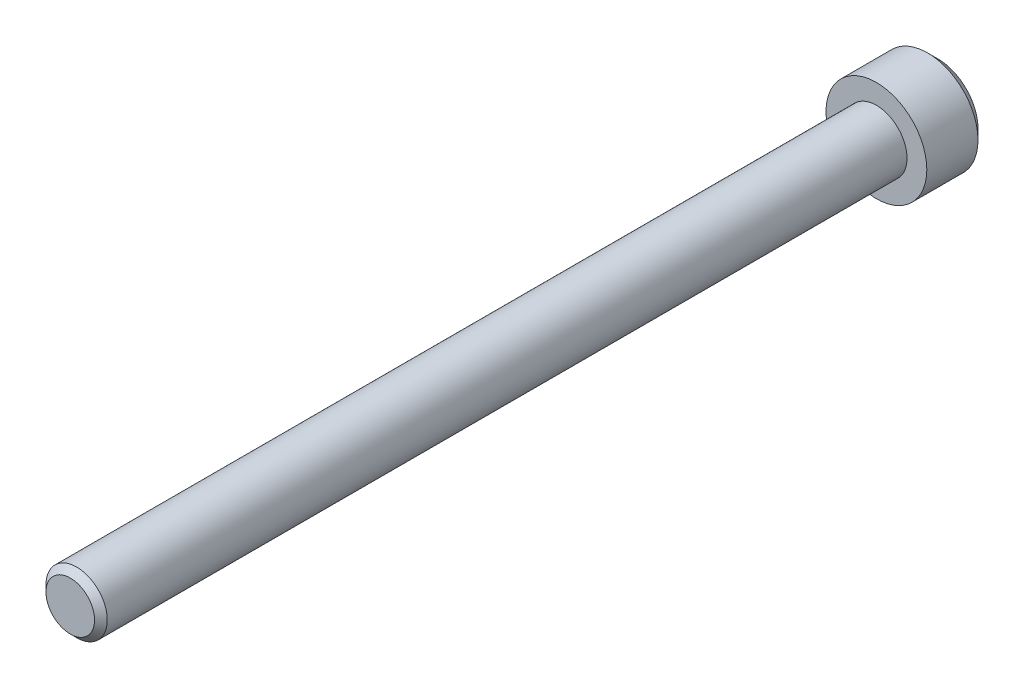
ISO-10303-21;
HEADER;
FILE_DESCRIPTION(('STEP AP214'),'2;1');
FILE_NAME('part.step','',(''),(''),'','','');
FILE_SCHEMA(('AUTOMOTIVE_DESIGN { 1 0 10303 214 1 1 1 1 }'));
ENDSEC;
DATA;
#1=APPLICATION_CONTEXT('core data for automotive mechanical design processes');
#2=APPLICATION_PROTOCOL_DEFINITION('international standard','automotive_design',2000,#1);
#3=PRODUCT_CONTEXT('',#1,'mechanical');
#4=PRODUCT('Part','Part','',(#3));
#5=PRODUCT_RELATED_PRODUCT_CATEGORY('part','',(#4));
#6=PRODUCT_DEFINITION_FORMATION('','',#4);
#7=PRODUCT_DEFINITION_CONTEXT('part definition',#1,'design');
#8=PRODUCT_DEFINITION('design','',#6,#7);
#9=PRODUCT_DEFINITION_SHAPE('','',#8);
#10=(LENGTH_UNIT() NAMED_UNIT(*) SI_UNIT(.MILLI.,.METRE.));
#11=(NAMED_UNIT(*) PLANE_ANGLE_UNIT() SI_UNIT($,.RADIAN.));
#12=(NAMED_UNIT(*) SI_UNIT($,.STERADIAN.) SOLID_ANGLE_UNIT());
#13=UNCERTAINTY_MEASURE_WITH_UNIT(LENGTH_MEASURE(1.E-05),#10,'distance_accuracy_value','');
#14=(GEOMETRIC_REPRESENTATION_CONTEXT(3) GLOBAL_UNCERTAINTY_ASSIGNED_CONTEXT((#13)) GLOBAL_UNIT_ASSIGNED_CONTEXT((#10,
#11,#12)) REPRESENTATION_CONTEXT('',''));
#15=CARTESIAN_POINT('',(0.,0.,0.));
#16=DIRECTION('',(0.,0.,1.));
#17=DIRECTION('',(1.,0.,0.));
#18=AXIS2_PLACEMENT_3D('',#15,#16,#17);
#19=CARTESIAN_POINT('',(75.6412,46.355,-54.2417));
#20=DIRECTION('',(0.,0.,1.));
#21=DIRECTION('',(1.,0.,0.));
#22=AXIS2_PLACEMENT_3D('',#19,#20,#21);
#23=PLANE('',#22);
#24=DIRECTION('',(0.608447428642477,0.793594182550728,0.));
#25=VECTOR('',#24,1.);
#26=CARTESIAN_POINT('',(77.2159884559992,45.1476121337877,-54.2417));
#27=LINE('',#26,#25);
#28=CARTESIAN_POINT('',(77.9130741655732,46.0568166727753,-54.2417));
#29=VERTEX_POINT('',#28);
#30=CARTESIAN_POINT('',(76.5189027464251,44.2384075947999,-54.2417));
#31=VERTEX_POINT('',#30);
#32=EDGE_CURVE('E131',#29,#31,#27,.F.);
#33=ORIENTED_EDGE('',*,*,#32,.T.);
#34=DIRECTION('',(0.991496436705714,-0.13013383879634,0.));
#35=VECTOR('',#34,1.);
#36=CARTESIAN_POINT('',(75.3829656636386,44.3874992584122,-54.2417));
#37=LINE('',#36,#35);
#38=CARTESIAN_POINT('',(74.2470285808521,44.5365909220243,-54.2417));
#39=VERTEX_POINT('',#38);
#40=EDGE_CURVE('E135',#31,#39,#37,.F.);
#41=ORIENTED_EDGE('',*,*,#40,.T.);
#42=DIRECTION('',(0.383049008063238,-0.923728021347068,0.));
#43=VECTOR('',#42,1.);
#44=CARTESIAN_POINT('',(73.8081772076394,45.5948871246245,-54.2417));
#45=LINE('',#44,#43);
#46=CARTESIAN_POINT('',(73.369325834427,46.6531833272247,-54.2417));
#47=VERTEX_POINT('',#46);
#48=EDGE_CURVE('E83',#39,#47,#45,.F.);
#49=ORIENTED_EDGE('',*,*,#48,.T.);
#50=DIRECTION('',(-0.608447428642477,-0.793594182550728,0.));
#51=VECTOR('',#50,1.);
#52=CARTESIAN_POINT('',(74.066411544001,47.5623878662123,-54.2417));
#53=LINE('',#52,#51);
#54=CARTESIAN_POINT('',(74.7634972535751,48.4715924052002,-54.2417));
#55=VERTEX_POINT('',#54);
#56=EDGE_CURVE('E66',#47,#55,#53,.F.);
#57=ORIENTED_EDGE('',*,*,#56,.T.);
#58=DIRECTION('',(-0.991496436705714,0.13013383879634,0.));
#59=VECTOR('',#58,1.);
#60=CARTESIAN_POINT('',(75.8994343363616,48.3225007415878,-54.2417));
#61=LINE('',#60,#59);
#62=CARTESIAN_POINT('',(77.0353714191481,48.1734090779756,-54.2417));
#63=VERTEX_POINT('',#62);
#64=EDGE_CURVE('E71',#55,#63,#61,.F.);
#65=ORIENTED_EDGE('',*,*,#64,.T.);
#66=DIRECTION('',(-0.383049008063237,0.923728021347068,0.));
#67=VECTOR('',#66,1.);
#68=CARTESIAN_POINT('',(77.4742227923606,47.1151128753755,-54.2417));
#69=LINE('',#68,#67);
#70=EDGE_CURVE('E127',#63,#29,#69,.F.);
#71=ORIENTED_EDGE('',*,*,#70,.T.);
#72=EDGE_LOOP('',(#33,#41,#49,#57,#65,#71));
#73=FACE_BOUND('',#72,.T.);
#74=ADVANCED_FACE('F16',(#73),#23,.F.);
#75=CARTESIAN_POINT('',(75.8994343363616,48.3225007415878,-55.3847));
#76=DIRECTION('',(0.13013383879634,0.991496436705714,0.));
#77=DIRECTION('',(-0.991496436705714,0.13013383879634,0.));
#78=AXIS2_PLACEMENT_3D('',#75,#76,#77);
#79=PLANE('',#78);
#80=DIRECTION('',(0.,0.,1.));
#81=VECTOR('',#80,1.);
#82=CARTESIAN_POINT('',(74.7634972535751,48.4715924052002,-55.3847));
#83=LINE('',#82,#81);
#84=CARTESIAN_POINT('',(74.7634972535751,48.4715924052002,-56.5277));
#85=VERTEX_POINT('',#84);
#86=EDGE_CURVE('E73',#55,#85,#83,.F.);
#87=ORIENTED_EDGE('',*,*,#86,.T.);
#88=DIRECTION('',(-0.991496436705721,0.13013383879629,0.));
#89=VECTOR('',#88,1.);
#90=CARTESIAN_POINT('',(77.0353714191482,48.1734090779757,-56.5277));
#91=LINE('',#90,#89);
#92=CARTESIAN_POINT('',(77.0353714191481,48.1734090779756,-56.5277));
#93=VERTEX_POINT('',#92);
#94=EDGE_CURVE('E125',#93,#85,#91,.T.);
#95=ORIENTED_EDGE('',*,*,#94,.F.);
#96=DIRECTION('',(0.,0.,1.));
#97=VECTOR('',#96,1.);
#98=CARTESIAN_POINT('',(77.035371419148,48.1734090779756,-55.3847));
#99=LINE('',#98,#97);
#100=EDGE_CURVE('E76',#93,#63,#99,.T.);
#101=ORIENTED_EDGE('',*,*,#100,.T.);
#102=ORIENTED_EDGE('',*,*,#64,.F.);
#103=EDGE_LOOP('',(#87,#95,#101,#102));
#104=FACE_BOUND('',#103,.T.);
#105=ADVANCED_FACE('F72',(#104),#79,.F.);
#106=CARTESIAN_POINT('',(74.066411544001,47.5623878662123,-55.3847));
#107=DIRECTION('',(-0.793594182550728,0.608447428642477,0.));
#108=DIRECTION('',(-0.608447428642477,-0.793594182550728,0.));
#109=AXIS2_PLACEMENT_3D('',#106,#107,#108);
#110=PLANE('',#109);
#111=DIRECTION('',(0.,0.,1.));
#112=VECTOR('',#111,1.);
#113=CARTESIAN_POINT('',(73.3693258344268,46.6531833272246,-55.3847));
#114=LINE('',#113,#112);
#115=CARTESIAN_POINT('',(73.369325834427,46.6531833272247,-56.5277));
#116=VERTEX_POINT('',#115);
#117=EDGE_CURVE('E85',#47,#116,#114,.F.);
#118=ORIENTED_EDGE('',*,*,#117,.T.);
#119=DIRECTION('',(-0.608447428642512,-0.793594182550701,0.));
#120=VECTOR('',#119,1.);
#121=CARTESIAN_POINT('',(74.7634972535751,48.4715924052002,-56.5277));
#122=LINE('',#121,#120);
#123=EDGE_CURVE('E89',#85,#116,#122,.T.);
#124=ORIENTED_EDGE('',*,*,#123,.F.);
#125=ORIENTED_EDGE('',*,*,#86,.F.);
#126=ORIENTED_EDGE('',*,*,#56,.F.);
#127=EDGE_LOOP('',(#118,#124,#125,#126));
#128=FACE_BOUND('',#127,.T.);
#129=ADVANCED_FACE('F87',(#128),#110,.F.);
#130=CARTESIAN_POINT('',(73.8081772076394,45.5948871246245,-55.3847));
#131=DIRECTION('',(-0.923728021347068,-0.383049008063238,0.));
#132=DIRECTION('',(0.383049008063238,-0.923728021347068,0.));
#133=AXIS2_PLACEMENT_3D('',#130,#131,#132);
#134=PLANE('',#133);
#135=DIRECTION('',(0.,0.,1.));
#136=VECTOR('',#135,1.);
#137=CARTESIAN_POINT('',(74.2470285808521,44.5365909220245,-55.3847));
#138=LINE('',#137,#136);
#139=CARTESIAN_POINT('',(74.2470285808521,44.5365909220243,-56.5277));
#140=VERTEX_POINT('',#139);
#141=EDGE_CURVE('E137',#39,#140,#138,.F.);
#142=ORIENTED_EDGE('',*,*,#141,.T.);
#143=DIRECTION('',(0.383049008063221,-0.923728021347075,0.));
#144=VECTOR('',#143,1.);
#145=CARTESIAN_POINT('',(73.369325834427,46.6531833272247,-56.5277));
#146=LINE('',#145,#144);
#147=EDGE_CURVE('E121',#116,#140,#146,.T.);
#148=ORIENTED_EDGE('',*,*,#147,.F.);
#149=ORIENTED_EDGE('',*,*,#117,.F.);
#150=ORIENTED_EDGE('',*,*,#48,.F.);
#151=EDGE_LOOP('',(#142,#148,#149,#150));
#152=FACE_BOUND('',#151,.T.);
#153=ADVANCED_FACE('F141',(#152),#134,.F.);
#154=CARTESIAN_POINT('',(75.3829656636386,44.3874992584122,-55.3847));
#155=DIRECTION('',(-0.13013383879634,-0.991496436705714,0.));
#156=DIRECTION('',(0.991496436705714,-0.13013383879634,0.));
#157=AXIS2_PLACEMENT_3D('',#154,#155,#156);
#158=PLANE('',#157);
#159=DIRECTION('',(0.,0.,1.));
#160=VECTOR('',#159,1.);
#161=CARTESIAN_POINT('',(76.5189027464251,44.2384075947998,-55.3847));
#162=LINE('',#161,#160);
#163=CARTESIAN_POINT('',(76.5189027464251,44.2384075947999,-56.5277));
#164=VERTEX_POINT('',#163);
#165=EDGE_CURVE('E133',#31,#164,#162,.F.);
#166=ORIENTED_EDGE('',*,*,#165,.T.);
#167=DIRECTION('',(0.99149643670572,-0.130133838796296,0.));
#168=VECTOR('',#167,1.);
#169=CARTESIAN_POINT('',(74.2470285808521,44.5365909220243,-56.5277));
#170=LINE('',#169,#168);
#171=EDGE_CURVE('E118',#140,#164,#170,.T.);
#172=ORIENTED_EDGE('',*,*,#171,.F.);
#173=ORIENTED_EDGE('',*,*,#141,.F.);
#174=ORIENTED_EDGE('',*,*,#40,.F.);
#175=EDGE_LOOP('',(#166,#172,#173,#174));
#176=FACE_BOUND('',#175,.T.);
#177=ADVANCED_FACE('F151',(#176),#158,.F.);
#178=CARTESIAN_POINT('',(77.2159884559992,45.1476121337877,-55.3847));
#179=DIRECTION('',(0.793594182550728,-0.608447428642477,0.));
#180=DIRECTION('',(0.608447428642477,0.793594182550728,0.));
#181=AXIS2_PLACEMENT_3D('',#178,#179,#180);
#182=PLANE('',#181);
#183=DIRECTION('',(0.,0.,1.));
#184=VECTOR('',#183,1.);
#185=CARTESIAN_POINT('',(77.9130741655732,46.0568166727753,-55.3847));
#186=LINE('',#185,#184);
#187=CARTESIAN_POINT('',(77.9130741655732,46.0568166727753,-56.5277));
#188=VERTEX_POINT('',#187);
#189=EDGE_CURVE('E34',#29,#188,#186,.F.);
#190=ORIENTED_EDGE('',*,*,#189,.T.);
#191=DIRECTION('',(0.608447428642539,0.79359418255068,0.));
#192=VECTOR('',#191,1.);
#193=CARTESIAN_POINT('',(76.5189027464251,44.2384075947998,-56.5277));
#194=LINE('',#193,#192);
#195=EDGE_CURVE('E115',#164,#188,#194,.T.);
#196=ORIENTED_EDGE('',*,*,#195,.F.);
#197=ORIENTED_EDGE('',*,*,#165,.F.);
#198=ORIENTED_EDGE('',*,*,#32,.F.);
#199=EDGE_LOOP('',(#190,#196,#197,#198));
#200=FACE_BOUND('',#199,.T.);
#201=ADVANCED_FACE('F149',(#200),#182,.F.);
#202=CARTESIAN_POINT('',(77.4742227923606,47.1151128753755,-55.3847));
#203=DIRECTION('',(0.923728021347068,0.383049008063237,0.));
#204=DIRECTION('',(-0.383049008063237,0.923728021347068,0.));
#205=AXIS2_PLACEMENT_3D('',#202,#203,#204);
#206=PLANE('',#205);
#207=ORIENTED_EDGE('',*,*,#100,.F.);
#208=DIRECTION('',(-0.383049008063216,0.923728021347077,0.));
#209=VECTOR('',#208,1.);
#210=CARTESIAN_POINT('',(77.9130741655733,46.0568166727753,-56.5277));
#211=LINE('',#210,#209);
#212=EDGE_CURVE('E106',#188,#93,#211,.T.);
#213=ORIENTED_EDGE('',*,*,#212,.F.);
#214=ORIENTED_EDGE('',*,*,#189,.F.);
#215=ORIENTED_EDGE('',*,*,#70,.F.);
#216=EDGE_LOOP('',(#207,#213,#214,#215));
#217=FACE_BOUND('',#216,.T.);
#218=ADVANCED_FACE('F147',(#217),#206,.F.);
#219=CARTESIAN_POINT('',(75.6412,46.355,-56.5277));
#220=DIRECTION('',(0.,0.,-1.));
#221=DIRECTION('',(-1.,0.,0.));
#222=AXIS2_PLACEMENT_3D('',#219,#220,#221);
#223=PLANE('',#222);
#224=CARTESIAN_POINT('',(75.6412,46.355,-56.5277000007427));
#225=DIRECTION('',(0.,0.,1.));
#226=DIRECTION('',(1.,0.,0.));
#227=AXIS2_PLACEMENT_3D('',#224,#225,#226);
#228=CIRCLE('',#227,3.17500000071682);
#229=CARTESIAN_POINT('',(78.8162000007168,46.355,-56.5277000007427));
#230=VERTEX_POINT('',#229);
#231=EDGE_CURVE('E19',#230,#230,#228,.T.);
#232=ORIENTED_EDGE('',*,*,#231,.F.);
#233=EDGE_LOOP('',(#232));
#234=FACE_BOUND('',#233,.T.);
#235=ORIENTED_EDGE('',*,*,#195,.T.);
#236=ORIENTED_EDGE('',*,*,#212,.T.);
#237=ORIENTED_EDGE('',*,*,#94,.T.);
#238=ORIENTED_EDGE('',*,*,#123,.T.);
#239=ORIENTED_EDGE('',*,*,#147,.T.);
#240=ORIENTED_EDGE('',*,*,#171,.T.);
#241=EDGE_LOOP('',(#235,#236,#237,#238,#239,#240));
#242=FACE_BOUND('',#241,.T.);
#243=ADVANCED_FACE('F145',(#234,#242),#223,.T.);
#244=CARTESIAN_POINT('',(75.6412,46.355,-55.7339500002172));
#245=DIRECTION('',(0.,0.,1.));
#246=DIRECTION('',(1.,0.,0.));
#247=AXIS2_PLACEMENT_3D('',#244,#245,#246);
#248=CONICAL_SURFACE('',#247,3.96874999982188,0.785398162502687);
#249=CARTESIAN_POINT('',(75.6412,46.355,-55.73395));
#250=DIRECTION('',(0.,0.,1.));
#251=DIRECTION('',(1.,0.,0.));
#252=AXIS2_PLACEMENT_3D('',#249,#250,#251);
#253=CIRCLE('',#252,3.96875);
#254=CARTESIAN_POINT('',(79.60995,46.355,-55.73395));
#255=VERTEX_POINT('',#254);
#256=EDGE_CURVE('E98',#255,#255,#253,.T.);
#257=ORIENTED_EDGE('',*,*,#256,.F.);
#258=EDGE_LOOP('',(#257));
#259=FACE_BOUND('',#258,.T.);
#260=ORIENTED_EDGE('',*,*,#231,.T.);
#261=EDGE_LOOP('',(#260));
#262=FACE_BOUND('',#261,.T.);
#263=ADVANCED_FACE('F182',(#259,#262),#248,.T.);
#264=CARTESIAN_POINT('',(130.369226232822,59.055,11.7983));
#265=DIRECTION('',(0.,0.,-1.));
#266=DIRECTION('',(0.,1.,0.));
#267=AXIS2_PLACEMENT_3D('',#264,#265,#266);
#268=PLANE('',#267);
#269=CARTESIAN_POINT('',(75.6412,46.355,11.7983000000095));
#270=DIRECTION('',(0.,0.,-1.));
#271=DIRECTION('',(-1.,0.,0.));
#272=AXIS2_PLACEMENT_3D('',#269,#270,#271);
#273=CIRCLE('',#272,1.91299999999499);
#274=CARTESIAN_POINT('',(73.728200000005,46.355,11.7983000000095));
#275=VERTEX_POINT('',#274);
#276=EDGE_CURVE('E96',#275,#275,#273,.T.);
#277=ORIENTED_EDGE('',*,*,#276,.F.);
#278=EDGE_LOOP('',(#277));
#279=FACE_BOUND('',#278,.T.);
#280=ADVANCED_FACE('F179',(#279),#268,.F.);
#281=CARTESIAN_POINT('',(75.6412,46.355,-51.7017));
#282=DIRECTION('',(0.,0.,1.));
#283=DIRECTION('',(1.,0.,0.));
#284=AXIS2_PLACEMENT_3D('',#281,#282,#283);
#285=CYLINDRICAL_SURFACE('',#284,3.96875);
#286=ORIENTED_EDGE('',*,*,#256,.T.);
#287=EDGE_LOOP('',(#286));
#288=FACE_BOUND('',#287,.T.);
#289=CARTESIAN_POINT('',(75.6412,46.355,-51.7017));
#290=DIRECTION('',(0.,0.,1.));
#291=DIRECTION('',(1.,0.,0.));
#292=AXIS2_PLACEMENT_3D('',#289,#290,#291);
#293=CIRCLE('',#292,3.96875);
#294=CARTESIAN_POINT('',(79.60995,46.355,-51.7017));
#295=VERTEX_POINT('',#294);
#296=EDGE_CURVE('E94',#295,#295,#293,.T.);
#297=ORIENTED_EDGE('',*,*,#296,.F.);
#298=EDGE_LOOP('',(#297));
#299=FACE_BOUND('',#298,.T.);
#300=ADVANCED_FACE('F176',(#288,#299),#285,.T.);
#301=CARTESIAN_POINT('',(75.6412,46.355,11.2983000000213));
#302=DIRECTION('',(0.,0.,-1.));
#303=DIRECTION('',(-1.,0.,0.));
#304=AXIS2_PLACEMENT_3D('',#301,#302,#303);
#305=CONICAL_SURFACE('',#304,2.41299999998316,0.785398163397448);
#306=ORIENTED_EDGE('',*,*,#276,.T.);
#307=EDGE_LOOP('',(#306));
#308=FACE_BOUND('',#307,.T.);
#309=CARTESIAN_POINT('',(75.6412,46.355,11.2983));
#310=DIRECTION('',(0.,0.,-1.));
#311=DIRECTION('',(-1.,0.,0.));
#312=AXIS2_PLACEMENT_3D('',#309,#310,#311);
#313=CIRCLE('',#312,2.413);
#314=CARTESIAN_POINT('',(73.2282,46.355,11.2983));
#315=VERTEX_POINT('',#314);
#316=EDGE_CURVE('E25',#315,#315,#313,.T.);
#317=ORIENTED_EDGE('',*,*,#316,.F.);
#318=EDGE_LOOP('',(#317));
#319=FACE_BOUND('',#318,.T.);
#320=ADVANCED_FACE('F169',(#308,#319),#305,.T.);
#321=CARTESIAN_POINT('',(75.6412,46.355,-51.7017));
#322=DIRECTION('',(0.,0.,1.));
#323=DIRECTION('',(1.,0.,0.));
#324=AXIS2_PLACEMENT_3D('',#321,#322,#323);
#325=PLANE('',#324);
#326=CARTESIAN_POINT('',(75.6412,46.355,-51.7017));
#327=DIRECTION('',(0.,0.,-1.));
#328=DIRECTION('',(-1.,0.,0.));
#329=AXIS2_PLACEMENT_3D('',#326,#327,#328);
#330=CIRCLE('',#329,2.413);
#331=CARTESIAN_POINT('',(73.2282,46.355,-51.7017));
#332=VERTEX_POINT('',#331);
#333=EDGE_CURVE('E11',#332,#332,#330,.F.);
#334=ORIENTED_EDGE('',*,*,#333,.F.);
#335=EDGE_LOOP('',(#334));
#336=FACE_BOUND('',#335,.T.);
#337=ORIENTED_EDGE('',*,*,#296,.T.);
#338=EDGE_LOOP('',(#337));
#339=FACE_BOUND('',#338,.T.);
#340=ADVANCED_FACE('F163',(#336,#339),#325,.T.);
#341=CARTESIAN_POINT('',(75.6412,46.355,-51.7017));
#342=DIRECTION('',(0.,0.,-1.));
#343=DIRECTION('',(-1.,0.,0.));
#344=AXIS2_PLACEMENT_3D('',#341,#342,#343);
#345=CYLINDRICAL_SURFACE('',#344,2.413);
#346=ORIENTED_EDGE('',*,*,#333,.T.);
#347=EDGE_LOOP('',(#346));
#348=FACE_BOUND('',#347,.T.);
#349=ORIENTED_EDGE('',*,*,#316,.T.);
#350=EDGE_LOOP('',(#349));
#351=FACE_BOUND('',#350,.T.);
#352=ADVANCED_FACE('F161',(#348,#351),#345,.T.);
#353=CLOSED_SHELL('',(#74,#105,#129,#153,#177,#201,#218,#243,#263,#280,#300,#320,#340,#352));
#354=MANIFOLD_SOLID_BREP('B1',#353);
#355=ADVANCED_BREP_SHAPE_REPRESENTATION('',(#18,#354),#14);
#356=SHAPE_DEFINITION_REPRESENTATION(#9,#355);
ENDSEC;
END-ISO-10303-21;
